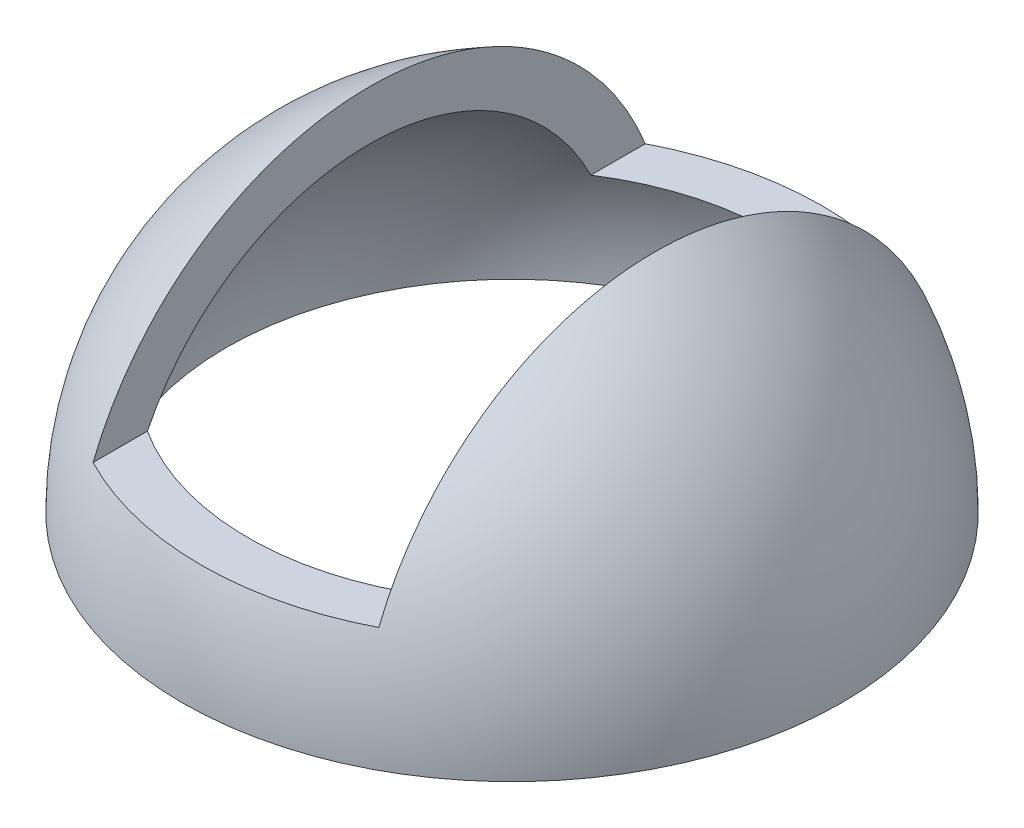
ISO-10303-21;
HEADER;
FILE_DESCRIPTION(('STEP AP214'),'2;1');
FILE_NAME('part.step','',(''),(''),'','','');
FILE_SCHEMA(('AUTOMOTIVE_DESIGN { 1 0 10303 214 1 1 1 1 }'));
ENDSEC;
DATA;
#1=APPLICATION_CONTEXT('core data for automotive mechanical design processes');
#2=APPLICATION_PROTOCOL_DEFINITION('international standard','automotive_design',2000,#1);
#3=PRODUCT_CONTEXT('',#1,'mechanical');
#4=PRODUCT('Part','Part','',(#3));
#5=PRODUCT_RELATED_PRODUCT_CATEGORY('part','',(#4));
#6=PRODUCT_DEFINITION_FORMATION('','',#4);
#7=PRODUCT_DEFINITION_CONTEXT('part definition',#1,'design');
#8=PRODUCT_DEFINITION('design','',#6,#7);
#9=PRODUCT_DEFINITION_SHAPE('','',#8);
#10=(LENGTH_UNIT() NAMED_UNIT(*) SI_UNIT(.MILLI.,.METRE.));
#11=(NAMED_UNIT(*) PLANE_ANGLE_UNIT() SI_UNIT($,.RADIAN.));
#12=(NAMED_UNIT(*) SI_UNIT($,.STERADIAN.) SOLID_ANGLE_UNIT());
#13=UNCERTAINTY_MEASURE_WITH_UNIT(LENGTH_MEASURE(1.E-05),#10,'distance_accuracy_value','');
#14=(GEOMETRIC_REPRESENTATION_CONTEXT(3) GLOBAL_UNCERTAINTY_ASSIGNED_CONTEXT((#13)) GLOBAL_UNIT_ASSIGNED_CONTEXT((#10,
#11,#12)) REPRESENTATION_CONTEXT('',''));
#15=CARTESIAN_POINT('',(0.,0.,0.));
#16=DIRECTION('',(0.,0.,1.));
#17=DIRECTION('',(1.,0.,0.));
#18=AXIS2_PLACEMENT_3D('',#15,#16,#17);
#19=CARTESIAN_POINT('',(0.,0.,0.));
#20=DIRECTION('',(0.,1.,0.));
#21=DIRECTION('',(-1.,0.,0.));
#22=AXIS2_PLACEMENT_3D('',#19,#20,#21);
#23=SPHERICAL_SURFACE('',#22,16.51);
#24=CARTESIAN_POINT('',(8.255,0.,0.));
#25=DIRECTION('',(1.,0.,0.));
#26=DIRECTION('',(0.,1.,0.));
#27=AXIS2_PLACEMENT_3D('',#24,#25,#26);
#28=CIRCLE('',#27,14.2980794164811);
#29=CARTESIAN_POINT('',(8.255,6.35,12.8106430361633));
#30=VERTEX_POINT('',#29);
#31=CARTESIAN_POINT('',(8.255,6.35,-12.8106430361633));
#32=VERTEX_POINT('',#31);
#33=EDGE_CURVE('E100',#30,#32,#28,.F.);
#34=ORIENTED_EDGE('',*,*,#33,.T.);
#35=CARTESIAN_POINT('',(0.,6.35,0.));
#36=DIRECTION('',(0.,-1.,0.));
#37=DIRECTION('',(1.,0.,0.));
#38=AXIS2_PLACEMENT_3D('',#35,#36,#37);
#39=CIRCLE('',#38,15.24);
#40=CARTESIAN_POINT('',(-8.255,6.35,-12.8106430361633));
#41=VERTEX_POINT('',#40);
#42=EDGE_CURVE('E103',#32,#41,#39,.F.);
#43=ORIENTED_EDGE('',*,*,#42,.T.);
#44=CARTESIAN_POINT('',(-8.255,0.,0.));
#45=DIRECTION('',(-1.,0.,0.));
#46=DIRECTION('',(0.,-1.,0.));
#47=AXIS2_PLACEMENT_3D('',#44,#45,#46);
#48=CIRCLE('',#47,14.2980794164811);
#49=CARTESIAN_POINT('',(-8.255,6.35,12.8106430361633));
#50=VERTEX_POINT('',#49);
#51=EDGE_CURVE('E88',#41,#50,#48,.F.);
#52=ORIENTED_EDGE('',*,*,#51,.T.);
#53=EDGE_CURVE('E104',#50,#30,#39,.F.);
#54=ORIENTED_EDGE('',*,*,#53,.T.);
#55=EDGE_LOOP('',(#34,#43,#52,#54));
#56=FACE_BOUND('',#55,.T.);
#57=CARTESIAN_POINT('',(0.,0.,0.));
#58=DIRECTION('',(0.,1.,0.));
#59=DIRECTION('',(-1.,0.,0.));
#60=AXIS2_PLACEMENT_3D('',#57,#58,#59);
#61=CIRCLE('',#60,16.51);
#62=CARTESIAN_POINT('',(-16.51,0.,0.));
#63=VERTEX_POINT('',#62);
#64=EDGE_CURVE('E82',#63,#63,#61,.T.);
#65=ORIENTED_EDGE('',*,*,#64,.F.);
#66=EDGE_LOOP('',(#65));
#67=FACE_BOUND('',#66,.T.);
#68=ADVANCED_FACE('F33',(#56,#67),#23,.F.);
#69=CARTESIAN_POINT('',(19.05,0.,0.));
#70=DIRECTION('',(0.,1.,0.));
#71=DIRECTION('',(-1.,0.,0.));
#72=AXIS2_PLACEMENT_3D('',#69,#70,#71);
#73=PLANE('',#72);
#74=CARTESIAN_POINT('',(0.,0.,0.));
#75=DIRECTION('',(0.,1.,0.));
#76=DIRECTION('',(-1.,0.,0.));
#77=AXIS2_PLACEMENT_3D('',#74,#75,#76);
#78=CIRCLE('',#77,19.05);
#79=CARTESIAN_POINT('',(-19.05,0.,0.));
#80=VERTEX_POINT('',#79);
#81=EDGE_CURVE('E96',#80,#80,#78,.T.);
#82=ORIENTED_EDGE('',*,*,#81,.F.);
#83=EDGE_LOOP('',(#82));
#84=FACE_BOUND('',#83,.T.);
#85=ORIENTED_EDGE('',*,*,#64,.T.);
#86=EDGE_LOOP('',(#85));
#87=FACE_BOUND('',#86,.T.);
#88=ADVANCED_FACE('F120',(#84,#87),#73,.F.);
#89=CARTESIAN_POINT('',(0.,0.,0.));
#90=DIRECTION('',(0.,1.,0.));
#91=DIRECTION('',(1.,0.,0.));
#92=AXIS2_PLACEMENT_3D('',#89,#90,#91);
#93=SPHERICAL_SURFACE('',#92,19.05);
#94=CARTESIAN_POINT('',(8.255,0.,0.));
#95=DIRECTION('',(1.,0.,0.));
#96=DIRECTION('',(0.,1.,0.));
#97=AXIS2_PLACEMENT_3D('',#94,#95,#96);
#98=CIRCLE('',#97,17.1685024099366);
#99=CARTESIAN_POINT('',(8.255,6.35,-15.9510179925922));
#100=VERTEX_POINT('',#99);
#101=CARTESIAN_POINT('',(8.255,6.35,15.9510179925922));
#102=VERTEX_POINT('',#101);
#103=EDGE_CURVE('E81',#100,#102,#98,.T.);
#104=ORIENTED_EDGE('',*,*,#103,.T.);
#105=CARTESIAN_POINT('',(0.,6.35,0.));
#106=DIRECTION('',(0.,-1.,0.));
#107=DIRECTION('',(1.,0.,0.));
#108=AXIS2_PLACEMENT_3D('',#105,#106,#107);
#109=CIRCLE('',#108,17.9605122421383);
#110=CARTESIAN_POINT('',(-8.255,6.35,15.9510179925922));
#111=VERTEX_POINT('',#110);
#112=EDGE_CURVE('E11',#102,#111,#109,.T.);
#113=ORIENTED_EDGE('',*,*,#112,.T.);
#114=CARTESIAN_POINT('',(-8.255,0.,0.));
#115=DIRECTION('',(-1.,0.,0.));
#116=DIRECTION('',(0.,-1.,0.));
#117=AXIS2_PLACEMENT_3D('',#114,#115,#116);
#118=CIRCLE('',#117,17.1685024099366);
#119=CARTESIAN_POINT('',(-8.255,6.35,-15.9510179925922));
#120=VERTEX_POINT('',#119);
#121=EDGE_CURVE('E36',#111,#120,#118,.T.);
#122=ORIENTED_EDGE('',*,*,#121,.T.);
#123=EDGE_CURVE('E42',#120,#100,#109,.T.);
#124=ORIENTED_EDGE('',*,*,#123,.T.);
#125=EDGE_LOOP('',(#104,#113,#122,#124));
#126=FACE_BOUND('',#125,.T.);
#127=ORIENTED_EDGE('',*,*,#81,.T.);
#128=EDGE_LOOP('',(#127));
#129=FACE_BOUND('',#128,.T.);
#130=ADVANCED_FACE('F91',(#126,#129),#93,.T.);
#131=CARTESIAN_POINT('',(-8.255,22.7688426218986,-63.5));
#132=DIRECTION('',(-1.,0.,0.));
#133=DIRECTION('',(0.,-1.,0.));
#134=AXIS2_PLACEMENT_3D('',#131,#132,#133);
#135=PLANE('',#134);
#136=DIRECTION('',(0.,0.,1.));
#137=VECTOR('',#136,1.);
#138=CARTESIAN_POINT('',(-8.255,6.35,-63.5));
#139=LINE('',#138,#137);
#140=EDGE_CURVE('E76',#120,#41,#139,.T.);
#141=ORIENTED_EDGE('',*,*,#140,.F.);
#142=ORIENTED_EDGE('',*,*,#121,.F.);
#143=EDGE_CURVE('E89',#50,#111,#139,.T.);
#144=ORIENTED_EDGE('',*,*,#143,.F.);
#145=ORIENTED_EDGE('',*,*,#51,.F.);
#146=EDGE_LOOP('',(#141,#142,#144,#145));
#147=FACE_BOUND('',#146,.T.);
#148=ADVANCED_FACE('F84',(#147),#135,.F.);
#149=CARTESIAN_POINT('',(8.255,22.7688426218986,-63.5));
#150=DIRECTION('',(1.,0.,0.));
#151=DIRECTION('',(0.,1.,0.));
#152=AXIS2_PLACEMENT_3D('',#149,#150,#151);
#153=PLANE('',#152);
#154=DIRECTION('',(0.,0.,1.));
#155=VECTOR('',#154,1.);
#156=CARTESIAN_POINT('',(8.255,6.35,-63.5));
#157=LINE('',#156,#155);
#158=EDGE_CURVE('E49',#30,#102,#157,.T.);
#159=ORIENTED_EDGE('',*,*,#158,.T.);
#160=ORIENTED_EDGE('',*,*,#103,.F.);
#161=EDGE_CURVE('E57',#100,#32,#157,.T.);
#162=ORIENTED_EDGE('',*,*,#161,.T.);
#163=ORIENTED_EDGE('',*,*,#33,.F.);
#164=EDGE_LOOP('',(#159,#160,#162,#163));
#165=FACE_BOUND('',#164,.T.);
#166=ADVANCED_FACE('F108',(#165),#153,.F.);
#167=CARTESIAN_POINT('',(-8.255,6.35,-63.5));
#168=DIRECTION('',(0.,-1.,0.));
#169=DIRECTION('',(1.,0.,0.));
#170=AXIS2_PLACEMENT_3D('',#167,#168,#169);
#171=PLANE('',#170);
#172=ORIENTED_EDGE('',*,*,#161,.F.);
#173=ORIENTED_EDGE('',*,*,#123,.F.);
#174=ORIENTED_EDGE('',*,*,#140,.T.);
#175=ORIENTED_EDGE('',*,*,#42,.F.);
#176=EDGE_LOOP('',(#172,#173,#174,#175));
#177=FACE_BOUND('',#176,.T.);
#178=ADVANCED_FACE('F75',(#177),#171,.F.);
#179=ORIENTED_EDGE('',*,*,#143,.T.);
#180=ORIENTED_EDGE('',*,*,#112,.F.);
#181=ORIENTED_EDGE('',*,*,#158,.F.);
#182=ORIENTED_EDGE('',*,*,#53,.F.);
#183=EDGE_LOOP('',(#179,#180,#181,#182));
#184=FACE_BOUND('',#183,.T.);
#185=ADVANCED_FACE('F111',(#184),#171,.F.);
#186=CLOSED_SHELL('',(#68,#88,#130,#148,#166,#178,#185));
#187=MANIFOLD_SOLID_BREP('B2',#186);
#188=ADVANCED_BREP_SHAPE_REPRESENTATION('',(#18,#187),#14);
#189=SHAPE_DEFINITION_REPRESENTATION(#9,#188);
ENDSEC;
END-ISO-10303-21;
